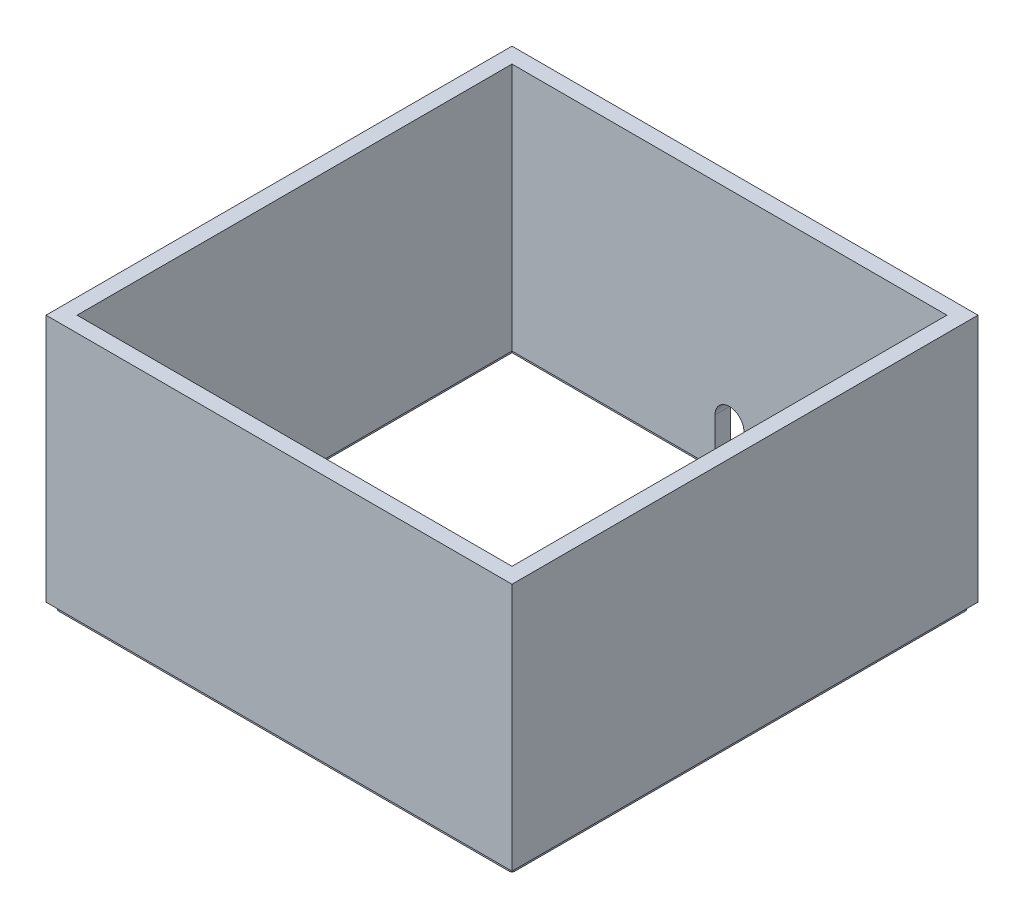
ISO-10303-21;
HEADER;
FILE_DESCRIPTION(('STEP AP214'),'2;1');
FILE_NAME('part.step','',(''),(''),'','','');
FILE_SCHEMA(('AUTOMOTIVE_DESIGN { 1 0 10303 214 1 1 1 1 }'));
ENDSEC;
DATA;
#1=APPLICATION_CONTEXT('core data for automotive mechanical design processes');
#2=APPLICATION_PROTOCOL_DEFINITION('international standard','automotive_design',2000,#1);
#3=PRODUCT_CONTEXT('',#1,'mechanical');
#4=PRODUCT('Part','Part','',(#3));
#5=PRODUCT_RELATED_PRODUCT_CATEGORY('part','',(#4));
#6=PRODUCT_DEFINITION_FORMATION('','',#4);
#7=PRODUCT_DEFINITION_CONTEXT('part definition',#1,'design');
#8=PRODUCT_DEFINITION('design','',#6,#7);
#9=PRODUCT_DEFINITION_SHAPE('','',#8);
#10=(LENGTH_UNIT() NAMED_UNIT(*) SI_UNIT(.MILLI.,.METRE.));
#11=(NAMED_UNIT(*) PLANE_ANGLE_UNIT() SI_UNIT($,.RADIAN.));
#12=(NAMED_UNIT(*) SI_UNIT($,.STERADIAN.) SOLID_ANGLE_UNIT());
#13=UNCERTAINTY_MEASURE_WITH_UNIT(LENGTH_MEASURE(1.E-05),#10,'distance_accuracy_value','');
#14=(GEOMETRIC_REPRESENTATION_CONTEXT(3) GLOBAL_UNCERTAINTY_ASSIGNED_CONTEXT((#13)) GLOBAL_UNIT_ASSIGNED_CONTEXT((#10,
#11,#12)) REPRESENTATION_CONTEXT('',''));
#15=CARTESIAN_POINT('',(0.,0.,0.));
#16=DIRECTION('',(0.,0.,1.));
#17=DIRECTION('',(1.,0.,0.));
#18=AXIS2_PLACEMENT_3D('',#15,#16,#17);
#19=CARTESIAN_POINT('',(-9.83885658579795,89.9794538159787,40.0336850693385));
#20=DIRECTION('',(0.,0.,-1.));
#21=DIRECTION('',(-1.,0.,0.));
#22=AXIS2_PLACEMENT_3D('',#19,#20,#21);
#23=PLANE('',#22);
#24=DIRECTION('',(-1.,0.,0.));
#25=VECTOR('',#24,1.);
#26=CARTESIAN_POINT('',(-9.83885658579795,91.9794538159787,40.0336850693385));
#27=LINE('',#26,#25);
#28=CARTESIAN_POINT('',(134.186143414203,91.9794538159787,40.033685069337));
#29=VERTEX_POINT('',#28);
#30=CARTESIAN_POINT('',(67.3285483427066,91.9794538159787,40.0336850693377));
#31=VERTEX_POINT('',#30);
#32=EDGE_CURVE('E279',#29,#31,#27,.T.);
#33=ORIENTED_EDGE('',*,*,#32,.T.);
#34=DIRECTION('',(0.,-1.,0.));
#35=VECTOR('',#34,1.);
#36=CARTESIAN_POINT('',(67.3285483427066,89.9794538159787,40.0336850693377));
#37=LINE('',#36,#35);
#38=CARTESIAN_POINT('',(67.3285483427066,89.9794538159787,40.0336850693378));
#39=VERTEX_POINT('',#38);
#40=EDGE_CURVE('E257',#31,#39,#37,.T.);
#41=ORIENTED_EDGE('',*,*,#40,.T.);
#42=DIRECTION('',(-1.,0.,0.));
#43=VECTOR('',#42,1.);
#44=CARTESIAN_POINT('',(-9.83885658579795,89.9794538159787,40.0336850693385));
#45=LINE('',#44,#43);
#46=CARTESIAN_POINT('',(134.186143414203,89.9794538159787,40.033685069337));
#47=VERTEX_POINT('',#46);
#48=EDGE_CURVE('E271',#47,#39,#45,.T.);
#49=ORIENTED_EDGE('',*,*,#48,.F.);
#50=DIRECTION('',(0.,1.,0.));
#51=VECTOR('',#50,1.);
#52=CARTESIAN_POINT('',(134.186143414203,89.9794538159787,40.033685069337));
#53=LINE('',#52,#51);
#54=EDGE_CURVE('E287',#47,#29,#53,.T.);
#55=ORIENTED_EDGE('',*,*,#54,.T.);
#56=EDGE_LOOP('',(#33,#41,#49,#55));
#57=FACE_BOUND('',#56,.T.);
#58=ADVANCED_FACE('F32',(#57),#23,.F.);
#59=CARTESIAN_POINT('',(-9.83885658579797,89.9794538159787,38.0836850693385));
#60=DIRECTION('',(0.,0.,1.));
#61=DIRECTION('',(1.,0.,0.));
#62=AXIS2_PLACEMENT_3D('',#59,#60,#61);
#63=PLANE('',#62);
#64=DIRECTION('',(1.,0.,0.));
#65=VECTOR('',#64,1.);
#66=CARTESIAN_POINT('',(-9.83885658579797,89.9794538159787,38.0836850693385));
#67=LINE('',#66,#65);
#68=CARTESIAN_POINT('',(67.3285483427066,89.9794538159787,38.0836850693377));
#69=VERTEX_POINT('',#68);
#70=CARTESIAN_POINT('',(135.161143414202,89.9794538159787,38.0836850693377));
#71=VERTEX_POINT('',#70);
#72=EDGE_CURVE('E270',#69,#71,#67,.T.);
#73=ORIENTED_EDGE('',*,*,#72,.F.);
#74=DIRECTION('',(0.,1.,0.));
#75=VECTOR('',#74,1.);
#76=CARTESIAN_POINT('',(67.3285483427066,89.9794538159787,38.0836850693377));
#77=LINE('',#76,#75);
#78=CARTESIAN_POINT('',(67.3285483427066,91.9794538159787,38.0836850693377));
#79=VERTEX_POINT('',#78);
#80=EDGE_CURVE('E40',#69,#79,#77,.T.);
#81=ORIENTED_EDGE('',*,*,#80,.T.);
#82=DIRECTION('',(1.,0.,0.));
#83=VECTOR('',#82,1.);
#84=CARTESIAN_POINT('',(-9.83885658579797,91.9794538159787,38.0836850693385));
#85=LINE('',#84,#83);
#86=CARTESIAN_POINT('',(135.161143414202,91.9794538159787,38.083685069337));
#87=VERTEX_POINT('',#86);
#88=EDGE_CURVE('E265',#79,#87,#85,.T.);
#89=ORIENTED_EDGE('',*,*,#88,.T.);
#90=DIRECTION('',(0.,1.,0.));
#91=VECTOR('',#90,1.);
#92=CARTESIAN_POINT('',(135.161143414202,89.9794538159787,38.083685069337));
#93=LINE('',#92,#91);
#94=EDGE_CURVE('E274',#71,#87,#93,.T.);
#95=ORIENTED_EDGE('',*,*,#94,.F.);
#96=EDGE_LOOP('',(#73,#81,#89,#95));
#97=FACE_BOUND('',#96,.T.);
#98=ADVANCED_FACE('F435',(#97),#63,.F.);
#99=CARTESIAN_POINT('',(0.,91.9794538159787,0.));
#100=DIRECTION('',(0.,1.,0.));
#101=DIRECTION('',(0.,0.,1.));
#102=AXIS2_PLACEMENT_3D('',#99,#100,#101);
#103=PLANE('',#102);
#104=DIRECTION('',(-1.,0.,0.));
#105=VECTOR('',#104,1.);
#106=CARTESIAN_POINT('',(132.661143414203,91.9794538159787,41.5586850693377));
#107=LINE('',#106,#105);
#108=CARTESIAN_POINT('',(132.661143414203,91.9794538159787,41.5586850693377));
#109=VERTEX_POINT('',#108);
#110=CARTESIAN_POINT('',(67.3285483427066,91.9794538159787,41.5586850693377));
#111=VERTEX_POINT('',#110);
#112=EDGE_CURVE('E381',#109,#111,#107,.T.);
#113=ORIENTED_EDGE('',*,*,#112,.T.);
#114=DIRECTION('',(0.,0.,-1.));
#115=VECTOR('',#114,1.);
#116=CARTESIAN_POINT('',(67.3285483427066,91.9794538159787,0.));
#117=LINE('',#116,#115);
#118=EDGE_CURVE('E260',#111,#31,#117,.T.);
#119=ORIENTED_EDGE('',*,*,#118,.T.);
#120=ORIENTED_EDGE('',*,*,#32,.F.);
#121=DIRECTION('',(0.,0.,-1.));
#122=VECTOR('',#121,1.);
#123=CARTESIAN_POINT('',(134.186143414203,91.9794538159787,39.0586850693377));
#124=LINE('',#123,#122);
#125=CARTESIAN_POINT('',(134.186143414203,91.9794538159787,183.083685069337));
#126=VERTEX_POINT('',#125);
#127=EDGE_CURVE('E55',#126,#29,#124,.T.);
#128=ORIENTED_EDGE('',*,*,#127,.F.);
#129=DIRECTION('',(1.,0.,0.));
#130=VECTOR('',#129,1.);
#131=CARTESIAN_POINT('',(135.161143414203,91.9794538159787,183.083685069337));
#132=LINE('',#131,#130);
#133=CARTESIAN_POINT('',(-8.8638565857972,91.9794538159787,183.083685069338));
#134=VERTEX_POINT('',#133);
#135=EDGE_CURVE('E317',#134,#126,#132,.T.);
#136=ORIENTED_EDGE('',*,*,#135,.F.);
#137=DIRECTION('',(0.,0.,1.));
#138=VECTOR('',#137,1.);
#139=CARTESIAN_POINT('',(-8.8638565857972,91.9794538159787,184.058685069338));
#140=LINE('',#139,#138);
#141=CARTESIAN_POINT('',(-8.86385658579718,91.9794538159787,40.0336850693385));
#142=VERTEX_POINT('',#141);
#143=EDGE_CURVE('E343',#142,#134,#140,.T.);
#144=ORIENTED_EDGE('',*,*,#143,.F.);
#145=CARTESIAN_POINT('',(57.993738485699,91.9794538159787,40.0336850693378));
#146=VERTEX_POINT('',#145);
#147=EDGE_CURVE('E278',#146,#142,#27,.T.);
#148=ORIENTED_EDGE('',*,*,#147,.F.);
#149=DIRECTION('',(0.,0.,1.));
#150=VECTOR('',#149,1.);
#151=CARTESIAN_POINT('',(57.993738485699,91.9794538159787,0.));
#152=LINE('',#151,#150);
#153=CARTESIAN_POINT('',(57.993738485699,91.9794538159787,41.5586850693377));
#154=VERTEX_POINT('',#153);
#155=EDGE_CURVE('E247',#146,#154,#152,.T.);
#156=ORIENTED_EDGE('',*,*,#155,.T.);
#157=CARTESIAN_POINT('',(-7.3388565857972,91.9794538159787,41.5586850693377));
#158=VERTEX_POINT('',#157);
#159=EDGE_CURVE('E380',#154,#158,#107,.T.);
#160=ORIENTED_EDGE('',*,*,#159,.T.);
#161=DIRECTION('',(0.,0.,1.));
#162=VECTOR('',#161,1.);
#163=CARTESIAN_POINT('',(-7.3388565857972,91.9794538159787,181.558685069338));
#164=LINE('',#163,#162);
#165=CARTESIAN_POINT('',(-7.3388565857972,91.9794538159787,181.558685069338));
#166=VERTEX_POINT('',#165);
#167=EDGE_CURVE('E384',#158,#166,#164,.T.);
#168=ORIENTED_EDGE('',*,*,#167,.T.);
#169=DIRECTION('',(1.,0.,0.));
#170=VECTOR('',#169,1.);
#171=CARTESIAN_POINT('',(132.661143414203,91.9794538159787,181.558685069338));
#172=LINE('',#171,#170);
#173=CARTESIAN_POINT('',(132.661143414203,91.9794538159787,181.558685069338));
#174=VERTEX_POINT('',#173);
#175=EDGE_CURVE('E370',#166,#174,#172,.T.);
#176=ORIENTED_EDGE('',*,*,#175,.T.);
#177=DIRECTION('',(0.,0.,-1.));
#178=VECTOR('',#177,1.);
#179=CARTESIAN_POINT('',(132.661143414203,91.9794538159787,181.558685069338));
#180=LINE('',#179,#178);
#181=EDGE_CURVE('E366',#174,#109,#180,.T.);
#182=ORIENTED_EDGE('',*,*,#181,.T.);
#183=EDGE_LOOP('',(#113,#119,#120,#128,#136,#144,#148,#156,#160,#168,#176,#182));
#184=FACE_BOUND('',#183,.T.);
#185=ADVANCED_FACE('F510',(#184),#103,.F.);
#186=ORIENTED_EDGE('',*,*,#88,.F.);
#187=DIRECTION('',(0.,0.,-1.));
#188=VECTOR('',#187,1.);
#189=CARTESIAN_POINT('',(67.3285483427066,91.9794538159787,0.));
#190=LINE('',#189,#188);
#191=CARTESIAN_POINT('',(67.3285483427066,91.9794538159787,36.5586850693377));
#192=VERTEX_POINT('',#191);
#193=EDGE_CURVE('E254',#79,#192,#190,.T.);
#194=ORIENTED_EDGE('',*,*,#193,.T.);
#195=DIRECTION('',(-1.,0.,0.));
#196=VECTOR('',#195,1.);
#197=CARTESIAN_POINT('',(137.661143414203,91.9794538159787,36.5586850693377));
#198=LINE('',#197,#196);
#199=CARTESIAN_POINT('',(137.661143414203,91.9794538159787,36.5586850693377));
#200=VERTEX_POINT('',#199);
#201=EDGE_CURVE('E414',#200,#192,#198,.T.);
#202=ORIENTED_EDGE('',*,*,#201,.F.);
#203=DIRECTION('',(0.,0.,-1.));
#204=VECTOR('',#203,1.);
#205=CARTESIAN_POINT('',(137.661143414203,91.9794538159787,186.558685069338));
#206=LINE('',#205,#204);
#207=CARTESIAN_POINT('',(137.661143414203,91.9794538159787,186.558685069338));
#208=VERTEX_POINT('',#207);
#209=EDGE_CURVE('E399',#208,#200,#206,.T.);
#210=ORIENTED_EDGE('',*,*,#209,.F.);
#211=DIRECTION('',(1.,0.,0.));
#212=VECTOR('',#211,1.);
#213=CARTESIAN_POINT('',(137.661143414203,91.9794538159787,186.558685069338));
#214=LINE('',#213,#212);
#215=CARTESIAN_POINT('',(-12.3388565857972,91.9794538159787,186.558685069338));
#216=VERTEX_POINT('',#215);
#217=EDGE_CURVE('E404',#216,#208,#214,.T.);
#218=ORIENTED_EDGE('',*,*,#217,.F.);
#219=DIRECTION('',(0.,0.,1.));
#220=VECTOR('',#219,1.);
#221=CARTESIAN_POINT('',(-12.3388565857972,91.9794538159787,186.558685069338));
#222=LINE('',#221,#220);
#223=CARTESIAN_POINT('',(-12.3388565857972,91.9794538159787,36.5586850693377));
#224=VERTEX_POINT('',#223);
#225=EDGE_CURVE('E416',#224,#216,#222,.T.);
#226=ORIENTED_EDGE('',*,*,#225,.F.);
#227=CARTESIAN_POINT('',(57.993738485699,91.9794538159787,36.5586850693377));
#228=VERTEX_POINT('',#227);
#229=EDGE_CURVE('E413',#228,#224,#198,.T.);
#230=ORIENTED_EDGE('',*,*,#229,.F.);
#231=DIRECTION('',(0.,0.,1.));
#232=VECTOR('',#231,1.);
#233=CARTESIAN_POINT('',(57.993738485699,91.9794538159787,0.));
#234=LINE('',#233,#232);
#235=CARTESIAN_POINT('',(57.993738485699,91.9794538159787,38.0836850693378));
#236=VERTEX_POINT('',#235);
#237=EDGE_CURVE('E232',#228,#236,#234,.T.);
#238=ORIENTED_EDGE('',*,*,#237,.T.);
#239=CARTESIAN_POINT('',(-9.83885658579721,91.9794538159787,38.0836850693377));
#240=VERTEX_POINT('',#239);
#241=EDGE_CURVE('E275',#240,#236,#85,.T.);
#242=ORIENTED_EDGE('',*,*,#241,.F.);
#243=CARTESIAN_POINT('',(-9.8388565857972,91.9794538159787,39.0586850693377));
#244=DIRECTION('',(0.,-1.,0.));
#245=DIRECTION('',(0.,0.,-1.));
#246=AXIS2_PLACEMENT_3D('',#243,#244,#245);
#247=CIRCLE('',#246,0.975000000000002);
#248=CARTESIAN_POINT('',(-10.8138565857972,91.9794538159787,39.0586850693377));
#249=VERTEX_POINT('',#248);
#250=EDGE_CURVE('E356',#249,#240,#247,.T.);
#251=ORIENTED_EDGE('',*,*,#250,.F.);
#252=DIRECTION('',(0.,0.,-1.));
#253=VECTOR('',#252,1.);
#254=CARTESIAN_POINT('',(-10.8138565857972,91.9794538159787,184.058685069338));
#255=LINE('',#254,#253);
#256=CARTESIAN_POINT('',(-10.8138565857972,91.9794538159787,184.058685069338));
#257=VERTEX_POINT('',#256);
#258=EDGE_CURVE('E353',#257,#249,#255,.T.);
#259=ORIENTED_EDGE('',*,*,#258,.F.);
#260=CARTESIAN_POINT('',(-9.8388565857972,91.9794538159787,184.058685069338));
#261=DIRECTION('',(0.,-1.,0.));
#262=DIRECTION('',(0.,0.,-1.));
#263=AXIS2_PLACEMENT_3D('',#260,#261,#262);
#264=CIRCLE('',#263,0.975000000000002);
#265=CARTESIAN_POINT('',(-9.83885658579697,91.9794538159787,185.033685069338));
#266=VERTEX_POINT('',#265);
#267=EDGE_CURVE('E339',#266,#257,#264,.T.);
#268=ORIENTED_EDGE('',*,*,#267,.F.);
#269=DIRECTION('',(-1.,0.,0.));
#270=VECTOR('',#269,1.);
#271=CARTESIAN_POINT('',(135.161143414203,91.9794538159787,185.033685069337));
#272=LINE('',#271,#270);
#273=CARTESIAN_POINT('',(135.161143414203,91.9794538159787,185.033685069337));
#274=VERTEX_POINT('',#273);
#275=EDGE_CURVE('E325',#274,#266,#272,.T.);
#276=ORIENTED_EDGE('',*,*,#275,.F.);
#277=CARTESIAN_POINT('',(135.161143414203,91.9794538159787,184.058685069337));
#278=DIRECTION('',(0.,-1.,0.));
#279=DIRECTION('',(-1.,0.,0.));
#280=AXIS2_PLACEMENT_3D('',#277,#278,#279);
#281=CIRCLE('',#280,0.975000000000002);
#282=CARTESIAN_POINT('',(136.136143414203,91.9794538159787,184.058685069338));
#283=VERTEX_POINT('',#282);
#284=EDGE_CURVE('E313',#283,#274,#281,.T.);
#285=ORIENTED_EDGE('',*,*,#284,.F.);
#286=DIRECTION('',(0.,0.,1.));
#287=VECTOR('',#286,1.);
#288=CARTESIAN_POINT('',(136.136143414203,91.9794538159787,39.0586850693377));
#289=LINE('',#288,#287);
#290=CARTESIAN_POINT('',(136.136143414203,91.9794538159787,39.0586850693377));
#291=VERTEX_POINT('',#290);
#292=EDGE_CURVE('E301',#291,#283,#289,.T.);
#293=ORIENTED_EDGE('',*,*,#292,.F.);
#294=CARTESIAN_POINT('',(135.161143414203,91.9794538159787,39.0586850693377));
#295=DIRECTION('',(0.,-1.,0.));
#296=DIRECTION('',(0.,0.,1.));
#297=AXIS2_PLACEMENT_3D('',#294,#295,#296);
#298=CIRCLE('',#297,0.975000000000002);
#299=EDGE_CURVE('E290',#87,#291,#298,.T.);
#300=ORIENTED_EDGE('',*,*,#299,.F.);
#301=EDGE_LOOP('',(#186,#194,#202,#210,#218,#226,#230,#238,#242,#251,#259,#268,#276,#285,#293,#300));
#302=FACE_BOUND('',#301,.T.);
#303=ADVANCED_FACE('F441',(#302),#103,.F.);
#304=CARTESIAN_POINT('',(-9.8388565857972,89.9794538159787,39.0586850693377));
#305=DIRECTION('',(0.,1.,0.));
#306=DIRECTION('',(0.,0.,1.));
#307=AXIS2_PLACEMENT_3D('',#304,#305,#306);
#308=CYLINDRICAL_SURFACE('',#307,0.975000000000002);
#309=DIRECTION('',(0.,1.,0.));
#310=VECTOR('',#309,1.);
#311=CARTESIAN_POINT('',(-9.83885658579797,89.9794538159787,38.0836850693385));
#312=LINE('',#311,#310);
#313=CARTESIAN_POINT('',(-9.83885658579721,89.9794538159787,38.0836850693385));
#314=VERTEX_POINT('',#313);
#315=EDGE_CURVE('E284',#314,#240,#312,.T.);
#316=ORIENTED_EDGE('',*,*,#315,.F.);
#317=CARTESIAN_POINT('',(-9.8388565857972,89.9794538159787,39.0586850693377));
#318=DIRECTION('',(0.,-1.,0.));
#319=DIRECTION('',(0.,0.,-1.));
#320=AXIS2_PLACEMENT_3D('',#317,#318,#319);
#321=CIRCLE('',#320,0.975000000000002);
#322=CARTESIAN_POINT('',(-10.8138565857972,89.9794538159787,39.0586850693377));
#323=VERTEX_POINT('',#322);
#324=EDGE_CURVE('E345',#323,#314,#321,.T.);
#325=ORIENTED_EDGE('',*,*,#324,.F.);
#326=DIRECTION('',(0.,1.,0.));
#327=VECTOR('',#326,1.);
#328=CARTESIAN_POINT('',(-10.8138565857972,89.9794538159787,39.0586850693377));
#329=LINE('',#328,#327);
#330=EDGE_CURVE('E351',#323,#249,#329,.T.);
#331=ORIENTED_EDGE('',*,*,#330,.T.);
#332=ORIENTED_EDGE('',*,*,#250,.T.);
#333=EDGE_LOOP('',(#316,#325,#331,#332));
#334=FACE_BOUND('',#333,.T.);
#335=ADVANCED_FACE('F571',(#334),#308,.T.);
#336=CARTESIAN_POINT('',(-8.8638565857972,89.9794538159787,184.058685069338));
#337=DIRECTION('',(-1.,0.,0.));
#338=DIRECTION('',(0.,0.,1.));
#339=AXIS2_PLACEMENT_3D('',#336,#337,#338);
#340=PLANE('',#339);
#341=DIRECTION('',(0.,1.,0.));
#342=VECTOR('',#341,1.);
#343=CARTESIAN_POINT('',(-8.8638565857972,89.9794538159787,183.083685069338));
#344=LINE('',#343,#342);
#345=CARTESIAN_POINT('',(-8.8638565857972,89.9794538159787,183.083685069338));
#346=VERTEX_POINT('',#345);
#347=EDGE_CURVE('E336',#346,#134,#344,.T.);
#348=ORIENTED_EDGE('',*,*,#347,.F.);
#349=DIRECTION('',(0.,0.,1.));
#350=VECTOR('',#349,1.);
#351=CARTESIAN_POINT('',(-8.8638565857972,89.9794538159787,184.058685069338));
#352=LINE('',#351,#350);
#353=CARTESIAN_POINT('',(-8.86385658579718,89.9794538159787,40.0336850693385));
#354=VERTEX_POINT('',#353);
#355=EDGE_CURVE('E348',#354,#346,#352,.T.);
#356=ORIENTED_EDGE('',*,*,#355,.F.);
#357=DIRECTION('',(0.,-1.,0.));
#358=VECTOR('',#357,1.);
#359=CARTESIAN_POINT('',(-8.86385658579718,89.9794538159787,40.0336850693385));
#360=LINE('',#359,#358);
#361=EDGE_CURVE('E333',#142,#354,#360,.T.);
#362=ORIENTED_EDGE('',*,*,#361,.F.);
#363=ORIENTED_EDGE('',*,*,#143,.T.);
#364=EDGE_LOOP('',(#348,#356,#362,#363));
#365=FACE_BOUND('',#364,.T.);
#366=ADVANCED_FACE('F529',(#365),#340,.F.);
#367=CARTESIAN_POINT('',(0.,171.979453815979,0.));
#368=DIRECTION('',(0.,1.,0.));
#369=DIRECTION('',(0.,0.,1.));
#370=AXIS2_PLACEMENT_3D('',#367,#368,#369);
#371=PLANE('',#370);
#372=DIRECTION('',(0.,0.,-1.));
#373=VECTOR('',#372,1.);
#374=CARTESIAN_POINT('',(137.661143414203,171.979453815979,186.558685069338));
#375=LINE('',#374,#373);
#376=CARTESIAN_POINT('',(137.661143414203,171.979453815979,186.558685069338));
#377=VERTEX_POINT('',#376);
#378=CARTESIAN_POINT('',(137.661143414203,171.979453815979,36.5586850693377));
#379=VERTEX_POINT('',#378);
#380=EDGE_CURVE('E400',#377,#379,#375,.T.);
#381=ORIENTED_EDGE('',*,*,#380,.T.);
#382=DIRECTION('',(-1.,0.,0.));
#383=VECTOR('',#382,1.);
#384=CARTESIAN_POINT('',(137.661143414203,171.979453815979,36.5586850693377));
#385=LINE('',#384,#383);
#386=CARTESIAN_POINT('',(-12.3388565857972,171.979453815979,36.5586850693377));
#387=VERTEX_POINT('',#386);
#388=EDGE_CURVE('E403',#379,#387,#385,.T.);
#389=ORIENTED_EDGE('',*,*,#388,.T.);
#390=DIRECTION('',(0.,0.,1.));
#391=VECTOR('',#390,1.);
#392=CARTESIAN_POINT('',(-12.3388565857972,171.979453815979,186.558685069338));
#393=LINE('',#392,#391);
#394=CARTESIAN_POINT('',(-12.3388565857972,171.979453815979,186.558685069338));
#395=VERTEX_POINT('',#394);
#396=EDGE_CURVE('E406',#387,#395,#393,.T.);
#397=ORIENTED_EDGE('',*,*,#396,.T.);
#398=DIRECTION('',(1.,0.,0.));
#399=VECTOR('',#398,1.);
#400=CARTESIAN_POINT('',(137.661143414203,171.979453815979,186.558685069338));
#401=LINE('',#400,#399);
#402=EDGE_CURVE('E408',#395,#377,#401,.T.);
#403=ORIENTED_EDGE('',*,*,#402,.T.);
#404=EDGE_LOOP('',(#381,#389,#397,#403));
#405=FACE_BOUND('',#404,.T.);
#406=DIRECTION('',(-1.,0.,0.));
#407=VECTOR('',#406,1.);
#408=CARTESIAN_POINT('',(132.661143414203,171.979453815979,41.5586850693377));
#409=LINE('',#408,#407);
#410=CARTESIAN_POINT('',(132.661143414203,171.979453815979,41.5586850693377));
#411=VERTEX_POINT('',#410);
#412=CARTESIAN_POINT('',(-7.3388565857972,171.979453815979,41.5586850693377));
#413=VERTEX_POINT('',#412);
#414=EDGE_CURVE('E369',#411,#413,#409,.T.);
#415=ORIENTED_EDGE('',*,*,#414,.F.);
#416=DIRECTION('',(0.,0.,-1.));
#417=VECTOR('',#416,1.);
#418=CARTESIAN_POINT('',(132.661143414203,171.979453815979,181.558685069338));
#419=LINE('',#418,#417);
#420=CARTESIAN_POINT('',(132.661143414203,171.979453815979,181.558685069338));
#421=VERTEX_POINT('',#420);
#422=EDGE_CURVE('E367',#421,#411,#419,.T.);
#423=ORIENTED_EDGE('',*,*,#422,.F.);
#424=DIRECTION('',(1.,0.,0.));
#425=VECTOR('',#424,1.);
#426=CARTESIAN_POINT('',(132.661143414203,171.979453815979,181.558685069338));
#427=LINE('',#426,#425);
#428=CARTESIAN_POINT('',(-7.3388565857972,171.979453815979,181.558685069338));
#429=VERTEX_POINT('',#428);
#430=EDGE_CURVE('E375',#429,#421,#427,.T.);
#431=ORIENTED_EDGE('',*,*,#430,.F.);
#432=DIRECTION('',(0.,0.,1.));
#433=VECTOR('',#432,1.);
#434=CARTESIAN_POINT('',(-7.3388565857972,171.979453815979,181.558685069338));
#435=LINE('',#434,#433);
#436=EDGE_CURVE('E372',#413,#429,#435,.T.);
#437=ORIENTED_EDGE('',*,*,#436,.F.);
#438=EDGE_LOOP('',(#415,#423,#431,#437));
#439=FACE_BOUND('',#438,.T.);
#440=ADVANCED_FACE('F482',(#405,#439),#371,.T.);
#441=CARTESIAN_POINT('',(137.661143414203,171.979453815979,186.558685069338));
#442=DIRECTION('',(-1.,0.,0.));
#443=DIRECTION('',(0.,0.,1.));
#444=AXIS2_PLACEMENT_3D('',#441,#442,#443);
#445=PLANE('',#444);
#446=ORIENTED_EDGE('',*,*,#209,.T.);
#447=DIRECTION('',(0.,-1.,0.));
#448=VECTOR('',#447,1.);
#449=CARTESIAN_POINT('',(137.661143414203,171.979453815979,36.5586850693377));
#450=LINE('',#449,#448);
#451=EDGE_CURVE('E427',#379,#200,#450,.T.);
#452=ORIENTED_EDGE('',*,*,#451,.F.);
#453=ORIENTED_EDGE('',*,*,#380,.F.);
#454=DIRECTION('',(0.,-1.,0.));
#455=VECTOR('',#454,1.);
#456=CARTESIAN_POINT('',(137.661143414203,171.979453815979,186.558685069338));
#457=LINE('',#456,#455);
#458=EDGE_CURVE('E410',#377,#208,#457,.T.);
#459=ORIENTED_EDGE('',*,*,#458,.T.);
#460=EDGE_LOOP('',(#446,#452,#453,#459));
#461=FACE_BOUND('',#460,.T.);
#462=ADVANCED_FACE('F34',(#461),#445,.F.);
#463=CARTESIAN_POINT('',(137.661143414203,171.979453815979,36.5586850693377));
#464=DIRECTION('',(0.,0.,1.));
#465=DIRECTION('',(1.,0.,0.));
#466=AXIS2_PLACEMENT_3D('',#463,#464,#465);
#467=PLANE('',#466);
#468=ORIENTED_EDGE('',*,*,#201,.T.);
#469=DIRECTION('',(0.,-1.,0.));
#470=VECTOR('',#469,1.);
#471=CARTESIAN_POINT('',(67.3285483427066,91.9794538159787,36.5586850693377));
#472=LINE('',#471,#470);
#473=CARTESIAN_POINT('',(67.3285483427066,106.844407313501,36.5586850693377));
#474=VERTEX_POINT('',#473);
#475=EDGE_CURVE('E226',#474,#192,#472,.T.);
#476=ORIENTED_EDGE('',*,*,#475,.F.);
#477=CARTESIAN_POINT('',(62.6611434142028,106.844407313501,36.5586850693377));
#478=DIRECTION('',(0.,0.,-1.));
#479=DIRECTION('',(-1.,0.,0.));
#480=AXIS2_PLACEMENT_3D('',#477,#478,#479);
#481=CIRCLE('',#480,4.66740492850384);
#482=CARTESIAN_POINT('',(57.993738485699,106.844407313501,36.5586850693377));
#483=VERTEX_POINT('',#482);
#484=EDGE_CURVE('E221',#483,#474,#481,.T.);
#485=ORIENTED_EDGE('',*,*,#484,.F.);
#486=DIRECTION('',(0.,1.,0.));
#487=VECTOR('',#486,1.);
#488=CARTESIAN_POINT('',(57.993738485699,91.9794538159787,36.5586850693377));
#489=LINE('',#488,#487);
#490=EDGE_CURVE('E229',#228,#483,#489,.T.);
#491=ORIENTED_EDGE('',*,*,#490,.F.);
#492=ORIENTED_EDGE('',*,*,#229,.T.);
#493=DIRECTION('',(0.,-1.,0.));
#494=VECTOR('',#493,1.);
#495=CARTESIAN_POINT('',(-12.3388565857972,171.979453815979,36.5586850693377));
#496=LINE('',#495,#494);
#497=EDGE_CURVE('E424',#387,#224,#496,.T.);
#498=ORIENTED_EDGE('',*,*,#497,.F.);
#499=ORIENTED_EDGE('',*,*,#388,.F.);
#500=ORIENTED_EDGE('',*,*,#451,.T.);
#501=EDGE_LOOP('',(#468,#476,#485,#491,#492,#498,#499,#500));
#502=FACE_BOUND('',#501,.T.);
#503=ADVANCED_FACE('F237',(#502),#467,.F.);
#504=CARTESIAN_POINT('',(-12.3388565857972,171.979453815979,186.558685069338));
#505=DIRECTION('',(1.,0.,0.));
#506=DIRECTION('',(0.,0.,-1.));
#507=AXIS2_PLACEMENT_3D('',#504,#505,#506);
#508=PLANE('',#507);
#509=ORIENTED_EDGE('',*,*,#225,.T.);
#510=DIRECTION('',(0.,-1.,0.));
#511=VECTOR('',#510,1.);
#512=CARTESIAN_POINT('',(-12.3388565857972,171.979453815979,186.558685069338));
#513=LINE('',#512,#511);
#514=EDGE_CURVE('E421',#395,#216,#513,.T.);
#515=ORIENTED_EDGE('',*,*,#514,.F.);
#516=ORIENTED_EDGE('',*,*,#396,.F.);
#517=ORIENTED_EDGE('',*,*,#497,.T.);
#518=EDGE_LOOP('',(#509,#515,#516,#517));
#519=FACE_BOUND('',#518,.T.);
#520=ADVANCED_FACE('F478',(#519),#508,.F.);
#521=CARTESIAN_POINT('',(137.661143414203,171.979453815979,186.558685069338));
#522=DIRECTION('',(0.,0.,-1.));
#523=DIRECTION('',(-1.,0.,0.));
#524=AXIS2_PLACEMENT_3D('',#521,#522,#523);
#525=PLANE('',#524);
#526=ORIENTED_EDGE('',*,*,#217,.T.);
#527=ORIENTED_EDGE('',*,*,#458,.F.);
#528=ORIENTED_EDGE('',*,*,#402,.F.);
#529=ORIENTED_EDGE('',*,*,#514,.T.);
#530=EDGE_LOOP('',(#526,#527,#528,#529));
#531=FACE_BOUND('',#530,.T.);
#532=ADVANCED_FACE('F490',(#531),#525,.F.);
#533=CARTESIAN_POINT('',(132.661143414203,171.979453815979,181.558685069338));
#534=DIRECTION('',(-1.,0.,0.));
#535=DIRECTION('',(0.,0.,1.));
#536=AXIS2_PLACEMENT_3D('',#533,#534,#535);
#537=PLANE('',#536);
#538=ORIENTED_EDGE('',*,*,#181,.F.);
#539=DIRECTION('',(0.,-1.,0.));
#540=VECTOR('',#539,1.);
#541=CARTESIAN_POINT('',(132.661143414203,171.979453815979,181.558685069338));
#542=LINE('',#541,#540);
#543=EDGE_CURVE('E377',#421,#174,#542,.T.);
#544=ORIENTED_EDGE('',*,*,#543,.F.);
#545=ORIENTED_EDGE('',*,*,#422,.T.);
#546=DIRECTION('',(0.,-1.,0.));
#547=VECTOR('',#546,1.);
#548=CARTESIAN_POINT('',(132.661143414203,171.979453815979,41.5586850693377));
#549=LINE('',#548,#547);
#550=EDGE_CURVE('E396',#411,#109,#549,.T.);
#551=ORIENTED_EDGE('',*,*,#550,.T.);
#552=EDGE_LOOP('',(#538,#544,#545,#551));
#553=FACE_BOUND('',#552,.T.);
#554=ADVANCED_FACE('F492',(#553),#537,.T.);
#555=CARTESIAN_POINT('',(132.661143414203,171.979453815979,41.5586850693377));
#556=DIRECTION('',(0.,0.,1.));
#557=DIRECTION('',(1.,0.,0.));
#558=AXIS2_PLACEMENT_3D('',#555,#556,#557);
#559=PLANE('',#558);
#560=DIRECTION('',(0.,1.,0.));
#561=VECTOR('',#560,1.);
#562=CARTESIAN_POINT('',(67.3285483427066,171.979453815979,41.5586850693377));
#563=LINE('',#562,#561);
#564=CARTESIAN_POINT('',(67.3285483427066,106.844407313501,41.5586850693377));
#565=VERTEX_POINT('',#564);
#566=EDGE_CURVE('E263',#111,#565,#563,.T.);
#567=ORIENTED_EDGE('',*,*,#566,.F.);
#568=ORIENTED_EDGE('',*,*,#112,.F.);
#569=ORIENTED_EDGE('',*,*,#550,.F.);
#570=ORIENTED_EDGE('',*,*,#414,.T.);
#571=DIRECTION('',(0.,-1.,0.));
#572=VECTOR('',#571,1.);
#573=CARTESIAN_POINT('',(-7.3388565857972,171.979453815979,41.5586850693377));
#574=LINE('',#573,#572);
#575=EDGE_CURVE('E393',#413,#158,#574,.T.);
#576=ORIENTED_EDGE('',*,*,#575,.T.);
#577=ORIENTED_EDGE('',*,*,#159,.F.);
#578=DIRECTION('',(0.,-1.,0.));
#579=VECTOR('',#578,1.);
#580=CARTESIAN_POINT('',(57.993738485699,171.979453815979,41.5586850693377));
#581=LINE('',#580,#579);
#582=CARTESIAN_POINT('',(57.993738485699,106.844407313501,41.5586850693377));
#583=VERTEX_POINT('',#582);
#584=EDGE_CURVE('E250',#583,#154,#581,.T.);
#585=ORIENTED_EDGE('',*,*,#584,.F.);
#586=CARTESIAN_POINT('',(62.6611434142028,106.844407313501,41.5586850693377));
#587=DIRECTION('',(0.,0.,1.));
#588=DIRECTION('',(1.,0.,0.));
#589=AXIS2_PLACEMENT_3D('',#586,#587,#588);
#590=CIRCLE('',#589,4.66740492850384);
#591=EDGE_CURVE('E11',#565,#583,#590,.T.);
#592=ORIENTED_EDGE('',*,*,#591,.F.);
#593=EDGE_LOOP('',(#567,#568,#569,#570,#576,#577,#585,#592));
#594=FACE_BOUND('',#593,.T.);
#595=ADVANCED_FACE('F498',(#594),#559,.T.);
#596=CARTESIAN_POINT('',(-7.3388565857972,171.979453815979,181.558685069338));
#597=DIRECTION('',(1.,0.,0.));
#598=DIRECTION('',(0.,0.,-1.));
#599=AXIS2_PLACEMENT_3D('',#596,#597,#598);
#600=PLANE('',#599);
#601=ORIENTED_EDGE('',*,*,#167,.F.);
#602=ORIENTED_EDGE('',*,*,#575,.F.);
#603=ORIENTED_EDGE('',*,*,#436,.T.);
#604=DIRECTION('',(0.,-1.,0.));
#605=VECTOR('',#604,1.);
#606=CARTESIAN_POINT('',(-7.3388565857972,171.979453815979,181.558685069338));
#607=LINE('',#606,#605);
#608=EDGE_CURVE('E391',#429,#166,#607,.T.);
#609=ORIENTED_EDGE('',*,*,#608,.T.);
#610=EDGE_LOOP('',(#601,#602,#603,#609));
#611=FACE_BOUND('',#610,.T.);
#612=ADVANCED_FACE('F550',(#611),#600,.T.);
#613=CARTESIAN_POINT('',(132.661143414203,171.979453815979,181.558685069338));
#614=DIRECTION('',(0.,0.,-1.));
#615=DIRECTION('',(-1.,0.,0.));
#616=AXIS2_PLACEMENT_3D('',#613,#614,#615);
#617=PLANE('',#616);
#618=ORIENTED_EDGE('',*,*,#175,.F.);
#619=ORIENTED_EDGE('',*,*,#608,.F.);
#620=ORIENTED_EDGE('',*,*,#430,.T.);
#621=ORIENTED_EDGE('',*,*,#543,.T.);
#622=EDGE_LOOP('',(#618,#619,#620,#621));
#623=FACE_BOUND('',#622,.T.);
#624=ADVANCED_FACE('F553',(#623),#617,.T.);
#625=CARTESIAN_POINT('',(-9.8388565857972,89.9794538159787,184.058685069338));
#626=DIRECTION('',(0.,1.,0.));
#627=DIRECTION('',(0.,0.,1.));
#628=AXIS2_PLACEMENT_3D('',#625,#626,#627);
#629=CYLINDRICAL_SURFACE('',#628,0.975000000000002);
#630=CARTESIAN_POINT('',(-9.8388565857972,89.9794538159787,184.058685069338));
#631=DIRECTION('',(0.,-1.,0.));
#632=DIRECTION('',(0.,0.,-1.));
#633=AXIS2_PLACEMENT_3D('',#630,#631,#632);
#634=CIRCLE('',#633,0.975000000000002);
#635=CARTESIAN_POINT('',(-9.83885658579697,89.9794538159787,185.033685069338));
#636=VERTEX_POINT('',#635);
#637=CARTESIAN_POINT('',(-10.8138565857972,89.9794538159787,184.058685069338));
#638=VERTEX_POINT('',#637);
#639=EDGE_CURVE('E340',#636,#638,#634,.T.);
#640=ORIENTED_EDGE('',*,*,#639,.F.);
#641=DIRECTION('',(0.,1.,0.));
#642=VECTOR('',#641,1.);
#643=CARTESIAN_POINT('',(-9.83885658579697,89.9794538159787,185.033685069338));
#644=LINE('',#643,#642);
#645=EDGE_CURVE('E322',#636,#266,#644,.T.);
#646=ORIENTED_EDGE('',*,*,#645,.T.);
#647=ORIENTED_EDGE('',*,*,#267,.T.);
#648=DIRECTION('',(0.,1.,0.));
#649=VECTOR('',#648,1.);
#650=CARTESIAN_POINT('',(-10.8138565857972,89.9794538159787,184.058685069338));
#651=LINE('',#650,#649);
#652=EDGE_CURVE('E363',#638,#257,#651,.T.);
#653=ORIENTED_EDGE('',*,*,#652,.F.);
#654=EDGE_LOOP('',(#640,#646,#647,#653));
#655=FACE_BOUND('',#654,.T.);
#656=ADVANCED_FACE('F461',(#655),#629,.T.);
#657=CARTESIAN_POINT('',(-10.8138565857972,89.9794538159787,184.058685069338));
#658=DIRECTION('',(1.,0.,0.));
#659=DIRECTION('',(0.,0.,-1.));
#660=AXIS2_PLACEMENT_3D('',#657,#658,#659);
#661=PLANE('',#660);
#662=ORIENTED_EDGE('',*,*,#258,.T.);
#663=ORIENTED_EDGE('',*,*,#330,.F.);
#664=DIRECTION('',(0.,0.,-1.));
#665=VECTOR('',#664,1.);
#666=CARTESIAN_POINT('',(-10.8138565857972,89.9794538159787,184.058685069338));
#667=LINE('',#666,#665);
#668=EDGE_CURVE('E342',#638,#323,#667,.T.);
#669=ORIENTED_EDGE('',*,*,#668,.F.);
#670=ORIENTED_EDGE('',*,*,#652,.T.);
#671=EDGE_LOOP('',(#662,#663,#669,#670));
#672=FACE_BOUND('',#671,.T.);
#673=ADVANCED_FACE('F467',(#672),#661,.F.);
#674=CARTESIAN_POINT('',(-9.8388565857972,89.9794538159787,184.058685069338));
#675=DIRECTION('',(0.,-1.,0.));
#676=DIRECTION('',(0.,0.,-1.));
#677=AXIS2_PLACEMENT_3D('',#674,#675,#676);
#678=PLANE('',#677);
#679=DIRECTION('',(0.,0.,1.));
#680=VECTOR('',#679,1.);
#681=CARTESIAN_POINT('',(67.3285483427066,89.9794538159787,184.058685069338));
#682=LINE('',#681,#680);
#683=EDGE_CURVE('E252',#69,#39,#682,.T.);
#684=ORIENTED_EDGE('',*,*,#683,.F.);
#685=ORIENTED_EDGE('',*,*,#72,.T.);
#686=CARTESIAN_POINT('',(135.161143414203,89.9794538159787,39.0586850693377));
#687=DIRECTION('',(0.,-1.,0.));
#688=DIRECTION('',(0.,0.,1.));
#689=AXIS2_PLACEMENT_3D('',#686,#687,#688);
#690=CIRCLE('',#689,0.975000000000002);
#691=CARTESIAN_POINT('',(136.136143414203,89.9794538159787,39.0586850693377));
#692=VERTEX_POINT('',#691);
#693=EDGE_CURVE('E291',#71,#692,#690,.T.);
#694=ORIENTED_EDGE('',*,*,#693,.T.);
#695=DIRECTION('',(0.,0.,1.));
#696=VECTOR('',#695,1.);
#697=CARTESIAN_POINT('',(136.136143414203,89.9794538159787,39.0586850693377));
#698=LINE('',#697,#696);
#699=CARTESIAN_POINT('',(136.136143414203,89.9794538159787,184.058685069338));
#700=VERTEX_POINT('',#699);
#701=EDGE_CURVE('E293',#692,#700,#698,.T.);
#702=ORIENTED_EDGE('',*,*,#701,.T.);
#703=CARTESIAN_POINT('',(135.161143414203,89.9794538159787,184.058685069337));
#704=DIRECTION('',(0.,-1.,0.));
#705=DIRECTION('',(-1.,0.,0.));
#706=AXIS2_PLACEMENT_3D('',#703,#704,#705);
#707=CIRCLE('',#706,0.975000000000002);
#708=CARTESIAN_POINT('',(135.161143414203,89.9794538159787,185.033685069337));
#709=VERTEX_POINT('',#708);
#710=EDGE_CURVE('E314',#700,#709,#707,.T.);
#711=ORIENTED_EDGE('',*,*,#710,.T.);
#712=DIRECTION('',(-1.,0.,0.));
#713=VECTOR('',#712,1.);
#714=CARTESIAN_POINT('',(135.161143414203,89.9794538159787,185.033685069337));
#715=LINE('',#714,#713);
#716=EDGE_CURVE('E316',#709,#636,#715,.T.);
#717=ORIENTED_EDGE('',*,*,#716,.T.);
#718=ORIENTED_EDGE('',*,*,#639,.T.);
#719=ORIENTED_EDGE('',*,*,#668,.T.);
#720=ORIENTED_EDGE('',*,*,#324,.T.);
#721=CARTESIAN_POINT('',(57.993738485699,89.9794538159787,38.0836850693378));
#722=VERTEX_POINT('',#721);
#723=EDGE_CURVE('E266',#314,#722,#67,.T.);
#724=ORIENTED_EDGE('',*,*,#723,.T.);
#725=DIRECTION('',(0.,0.,-1.));
#726=VECTOR('',#725,1.);
#727=CARTESIAN_POINT('',(57.993738485699,89.9794538159787,184.058685069338));
#728=LINE('',#727,#726);
#729=CARTESIAN_POINT('',(57.993738485699,89.9794538159787,40.0336850693378));
#730=VERTEX_POINT('',#729);
#731=EDGE_CURVE('E47',#730,#722,#728,.T.);
#732=ORIENTED_EDGE('',*,*,#731,.F.);
#733=EDGE_CURVE('E269',#730,#354,#45,.T.);
#734=ORIENTED_EDGE('',*,*,#733,.T.);
#735=ORIENTED_EDGE('',*,*,#355,.T.);
#736=DIRECTION('',(1.,0.,0.));
#737=VECTOR('',#736,1.);
#738=CARTESIAN_POINT('',(135.161143414203,89.9794538159787,183.083685069337));
#739=LINE('',#738,#737);
#740=CARTESIAN_POINT('',(134.186143414203,89.9794538159787,183.083685069337));
#741=VERTEX_POINT('',#740);
#742=EDGE_CURVE('E320',#346,#741,#739,.T.);
#743=ORIENTED_EDGE('',*,*,#742,.T.);
#744=DIRECTION('',(0.,0.,-1.));
#745=VECTOR('',#744,1.);
#746=CARTESIAN_POINT('',(134.186143414203,89.9794538159787,39.0586850693377));
#747=LINE('',#746,#745);
#748=EDGE_CURVE('E296',#741,#47,#747,.T.);
#749=ORIENTED_EDGE('',*,*,#748,.T.);
#750=ORIENTED_EDGE('',*,*,#48,.T.);
#751=EDGE_LOOP('',(#684,#685,#694,#702,#711,#717,#718,#719,#720,#724,#732,#734,#735,#743,#749,#750));
#752=FACE_BOUND('',#751,.T.);
#753=ADVANCED_FACE('F448',(#752),#678,.T.);
#754=CARTESIAN_POINT('',(135.161143414203,89.9794538159787,183.083685069337));
#755=DIRECTION('',(0.,0.,1.));
#756=DIRECTION('',(1.,0.,0.));
#757=AXIS2_PLACEMENT_3D('',#754,#755,#756);
#758=PLANE('',#757);
#759=ORIENTED_EDGE('',*,*,#742,.F.);
#760=ORIENTED_EDGE('',*,*,#347,.T.);
#761=ORIENTED_EDGE('',*,*,#135,.T.);
#762=DIRECTION('',(0.,1.,0.));
#763=VECTOR('',#762,1.);
#764=CARTESIAN_POINT('',(134.186143414203,89.9794538159787,183.083685069337));
#765=LINE('',#764,#763);
#766=EDGE_CURVE('E310',#741,#126,#765,.T.);
#767=ORIENTED_EDGE('',*,*,#766,.F.);
#768=EDGE_LOOP('',(#759,#760,#761,#767));
#769=FACE_BOUND('',#768,.T.);
#770=ADVANCED_FACE('F514',(#769),#758,.F.);
#771=ORIENTED_EDGE('',*,*,#733,.F.);
#772=DIRECTION('',(0.,1.,0.));
#773=VECTOR('',#772,1.);
#774=CARTESIAN_POINT('',(57.993738485699,89.9794538159787,40.0336850693378));
#775=LINE('',#774,#773);
#776=EDGE_CURVE('E244',#730,#146,#775,.T.);
#777=ORIENTED_EDGE('',*,*,#776,.T.);
#778=ORIENTED_EDGE('',*,*,#147,.T.);
#779=ORIENTED_EDGE('',*,*,#361,.T.);
#780=EDGE_LOOP('',(#771,#777,#778,#779));
#781=FACE_BOUND('',#780,.T.);
#782=ADVANCED_FACE('F506',(#781),#23,.F.);
#783=CARTESIAN_POINT('',(135.161143414203,89.9794538159787,184.058685069337));
#784=DIRECTION('',(0.,1.,0.));
#785=DIRECTION('',(0.,0.,1.));
#786=AXIS2_PLACEMENT_3D('',#783,#784,#785);
#787=CYLINDRICAL_SURFACE('',#786,0.975000000000002);
#788=ORIENTED_EDGE('',*,*,#710,.F.);
#789=DIRECTION('',(0.,1.,0.));
#790=VECTOR('',#789,1.);
#791=CARTESIAN_POINT('',(136.136143414203,89.9794538159787,184.058685069338));
#792=LINE('',#791,#790);
#793=EDGE_CURVE('E298',#700,#283,#792,.T.);
#794=ORIENTED_EDGE('',*,*,#793,.T.);
#795=ORIENTED_EDGE('',*,*,#284,.T.);
#796=DIRECTION('',(0.,1.,0.));
#797=VECTOR('',#796,1.);
#798=CARTESIAN_POINT('',(135.161143414203,89.9794538159787,185.033685069337));
#799=LINE('',#798,#797);
#800=EDGE_CURVE('E330',#709,#274,#799,.T.);
#801=ORIENTED_EDGE('',*,*,#800,.F.);
#802=EDGE_LOOP('',(#788,#794,#795,#801));
#803=FACE_BOUND('',#802,.T.);
#804=ADVANCED_FACE('F453',(#803),#787,.T.);
#805=CARTESIAN_POINT('',(135.161143414203,89.9794538159787,185.033685069337));
#806=DIRECTION('',(0.,0.,-1.));
#807=DIRECTION('',(-1.,0.,0.));
#808=AXIS2_PLACEMENT_3D('',#805,#806,#807);
#809=PLANE('',#808);
#810=ORIENTED_EDGE('',*,*,#275,.T.);
#811=ORIENTED_EDGE('',*,*,#645,.F.);
#812=ORIENTED_EDGE('',*,*,#716,.F.);
#813=ORIENTED_EDGE('',*,*,#800,.T.);
#814=EDGE_LOOP('',(#810,#811,#812,#813));
#815=FACE_BOUND('',#814,.T.);
#816=ADVANCED_FACE('F458',(#815),#809,.F.);
#817=CARTESIAN_POINT('',(134.186143414203,89.9794538159787,39.0586850693377));
#818=DIRECTION('',(1.,0.,0.));
#819=DIRECTION('',(0.,0.,-1.));
#820=AXIS2_PLACEMENT_3D('',#817,#818,#819);
#821=PLANE('',#820);
#822=ORIENTED_EDGE('',*,*,#748,.F.);
#823=ORIENTED_EDGE('',*,*,#766,.T.);
#824=ORIENTED_EDGE('',*,*,#127,.T.);
#825=ORIENTED_EDGE('',*,*,#54,.F.);
#826=EDGE_LOOP('',(#822,#823,#824,#825));
#827=FACE_BOUND('',#826,.T.);
#828=ADVANCED_FACE('F536',(#827),#821,.F.);
#829=CARTESIAN_POINT('',(135.161143414203,89.9794538159787,39.0586850693377));
#830=DIRECTION('',(0.,1.,0.));
#831=DIRECTION('',(0.,0.,1.));
#832=AXIS2_PLACEMENT_3D('',#829,#830,#831);
#833=CYLINDRICAL_SURFACE('',#832,0.975000000000002);
#834=ORIENTED_EDGE('',*,*,#693,.F.);
#835=ORIENTED_EDGE('',*,*,#94,.T.);
#836=ORIENTED_EDGE('',*,*,#299,.T.);
#837=DIRECTION('',(0.,1.,0.));
#838=VECTOR('',#837,1.);
#839=CARTESIAN_POINT('',(136.136143414203,89.9794538159787,39.0586850693377));
#840=LINE('',#839,#838);
#841=EDGE_CURVE('E307',#692,#291,#840,.T.);
#842=ORIENTED_EDGE('',*,*,#841,.F.);
#843=EDGE_LOOP('',(#834,#835,#836,#842));
#844=FACE_BOUND('',#843,.T.);
#845=ADVANCED_FACE('F445',(#844),#833,.T.);
#846=CARTESIAN_POINT('',(136.136143414203,89.9794538159787,39.0586850693377));
#847=DIRECTION('',(-1.,0.,0.));
#848=DIRECTION('',(0.,0.,1.));
#849=AXIS2_PLACEMENT_3D('',#846,#847,#848);
#850=PLANE('',#849);
#851=ORIENTED_EDGE('',*,*,#292,.T.);
#852=ORIENTED_EDGE('',*,*,#793,.F.);
#853=ORIENTED_EDGE('',*,*,#701,.F.);
#854=ORIENTED_EDGE('',*,*,#841,.T.);
#855=EDGE_LOOP('',(#851,#852,#853,#854));
#856=FACE_BOUND('',#855,.T.);
#857=ADVANCED_FACE('F451',(#856),#850,.F.);
#858=ORIENTED_EDGE('',*,*,#241,.T.);
#859=DIRECTION('',(0.,-1.,0.));
#860=VECTOR('',#859,1.);
#861=CARTESIAN_POINT('',(57.993738485699,89.9794538159787,38.0836850693378));
#862=LINE('',#861,#860);
#863=EDGE_CURVE('E430',#236,#722,#862,.T.);
#864=ORIENTED_EDGE('',*,*,#863,.T.);
#865=ORIENTED_EDGE('',*,*,#723,.F.);
#866=ORIENTED_EDGE('',*,*,#315,.T.);
#867=EDGE_LOOP('',(#858,#864,#865,#866));
#868=FACE_BOUND('',#867,.T.);
#869=ADVANCED_FACE('F472',(#868),#63,.F.);
#870=CARTESIAN_POINT('',(67.3285483427066,91.9794538159787,46.5586850693377));
#871=DIRECTION('',(1.,0.,0.));
#872=DIRECTION('',(0.,0.,-1.));
#873=AXIS2_PLACEMENT_3D('',#870,#871,#872);
#874=PLANE('',#873);
#875=ORIENTED_EDGE('',*,*,#566,.T.);
#876=DIRECTION('',(0.,0.,-1.));
#877=VECTOR('',#876,1.);
#878=CARTESIAN_POINT('',(67.3285483427066,106.844407313501,46.5586850693377));
#879=LINE('',#878,#877);
#880=EDGE_CURVE('E225',#565,#474,#879,.T.);
#881=ORIENTED_EDGE('',*,*,#880,.T.);
#882=ORIENTED_EDGE('',*,*,#475,.T.);
#883=ORIENTED_EDGE('',*,*,#193,.F.);
#884=ORIENTED_EDGE('',*,*,#80,.F.);
#885=ORIENTED_EDGE('',*,*,#683,.T.);
#886=ORIENTED_EDGE('',*,*,#40,.F.);
#887=ORIENTED_EDGE('',*,*,#118,.F.);
#888=EDGE_LOOP('',(#875,#881,#882,#883,#884,#885,#886,#887));
#889=FACE_BOUND('',#888,.T.);
#890=ADVANCED_FACE('F537',(#889),#874,.F.);
#891=CARTESIAN_POINT('',(62.6611434142028,106.844407313501,46.5586850693377));
#892=DIRECTION('',(0.,0.,-1.));
#893=DIRECTION('',(-1.,0.,0.));
#894=AXIS2_PLACEMENT_3D('',#891,#892,#893);
#895=CYLINDRICAL_SURFACE('',#894,4.66740492850384);
#896=ORIENTED_EDGE('',*,*,#591,.T.);
#897=DIRECTION('',(0.,0.,-1.));
#898=VECTOR('',#897,1.);
#899=CARTESIAN_POINT('',(57.993738485699,106.844407313501,46.5586850693377));
#900=LINE('',#899,#898);
#901=EDGE_CURVE('E216',#583,#483,#900,.T.);
#902=ORIENTED_EDGE('',*,*,#901,.T.);
#903=ORIENTED_EDGE('',*,*,#484,.T.);
#904=ORIENTED_EDGE('',*,*,#880,.F.);
#905=EDGE_LOOP('',(#896,#902,#903,#904));
#906=FACE_BOUND('',#905,.T.);
#907=ADVANCED_FACE('F218',(#906),#895,.F.);
#908=CARTESIAN_POINT('',(57.993738485699,91.9794538159787,46.5586850693377));
#909=DIRECTION('',(-1.,0.,0.));
#910=DIRECTION('',(0.,0.,1.));
#911=AXIS2_PLACEMENT_3D('',#908,#909,#910);
#912=PLANE('',#911);
#913=ORIENTED_EDGE('',*,*,#584,.T.);
#914=ORIENTED_EDGE('',*,*,#155,.F.);
#915=ORIENTED_EDGE('',*,*,#776,.F.);
#916=ORIENTED_EDGE('',*,*,#731,.T.);
#917=ORIENTED_EDGE('',*,*,#863,.F.);
#918=ORIENTED_EDGE('',*,*,#237,.F.);
#919=ORIENTED_EDGE('',*,*,#490,.T.);
#920=ORIENTED_EDGE('',*,*,#901,.F.);
#921=EDGE_LOOP('',(#913,#914,#915,#916,#917,#918,#919,#920));
#922=FACE_BOUND('',#921,.T.);
#923=ADVANCED_FACE('F230',(#922),#912,.F.);
#924=CLOSED_SHELL('',(#58,#98,#185,#303,#335,#366,#440,#462,#503,#520,#532,#554,#595,#612,#624,
#656,#673,#753,#770,#782,#804,#816,#828,#845,#857,#869,#890,#907,#923));
#925=MANIFOLD_SOLID_BREP('B2',#924);
#926=ADVANCED_BREP_SHAPE_REPRESENTATION('',(#18,#925),#14);
#927=SHAPE_DEFINITION_REPRESENTATION(#9,#926);
ENDSEC;
END-ISO-10303-21;
